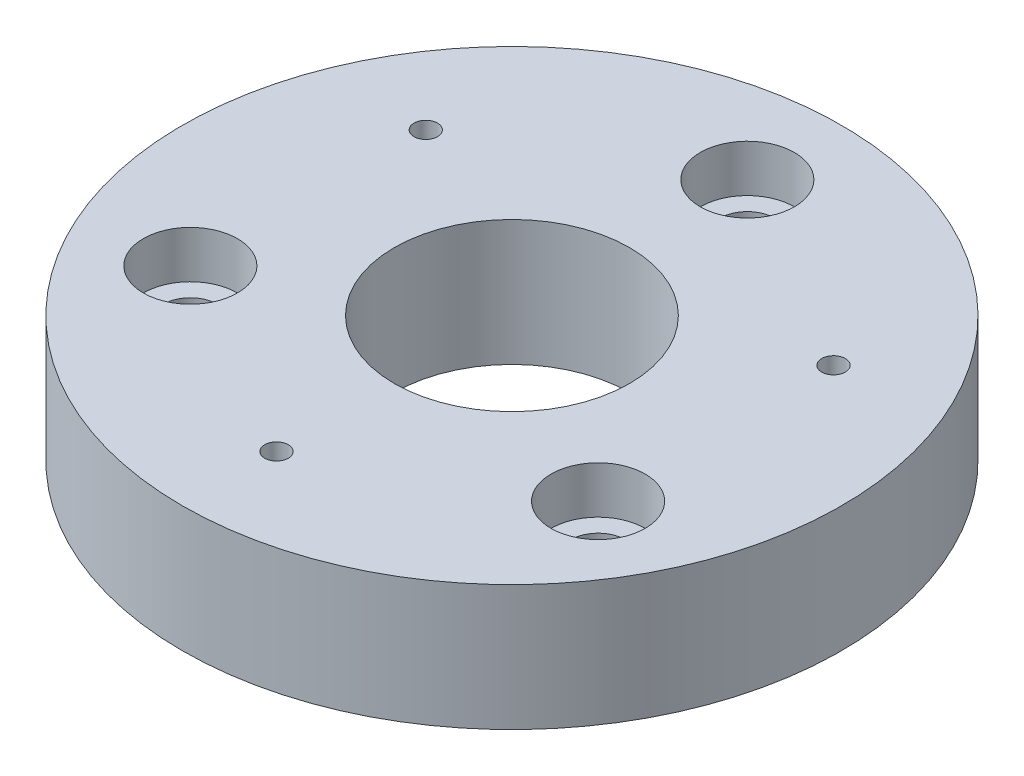
ISO-10303-21;
HEADER;
FILE_DESCRIPTION(('STEP AP214'),'2;1');
FILE_NAME('part.step','',(''),(''),'','','');
FILE_SCHEMA(('AUTOMOTIVE_DESIGN { 1 0 10303 214 1 1 1 1 }'));
ENDSEC;
DATA;
#1=APPLICATION_CONTEXT('core data for automotive mechanical design processes');
#2=APPLICATION_PROTOCOL_DEFINITION('international standard','automotive_design',2000,#1);
#3=PRODUCT_CONTEXT('',#1,'mechanical');
#4=PRODUCT('Part','Part','',(#3));
#5=PRODUCT_RELATED_PRODUCT_CATEGORY('part','',(#4));
#6=PRODUCT_DEFINITION_FORMATION('','',#4);
#7=PRODUCT_DEFINITION_CONTEXT('part definition',#1,'design');
#8=PRODUCT_DEFINITION('design','',#6,#7);
#9=PRODUCT_DEFINITION_SHAPE('','',#8);
#10=(LENGTH_UNIT() NAMED_UNIT(*) SI_UNIT(.MILLI.,.METRE.));
#11=(NAMED_UNIT(*) PLANE_ANGLE_UNIT() SI_UNIT($,.RADIAN.));
#12=(NAMED_UNIT(*) SI_UNIT($,.STERADIAN.) SOLID_ANGLE_UNIT());
#13=UNCERTAINTY_MEASURE_WITH_UNIT(LENGTH_MEASURE(1.E-05),#10,'distance_accuracy_value','');
#14=(GEOMETRIC_REPRESENTATION_CONTEXT(3) GLOBAL_UNCERTAINTY_ASSIGNED_CONTEXT((#13)) GLOBAL_UNIT_ASSIGNED_CONTEXT((#10,
#11,#12)) REPRESENTATION_CONTEXT('',''));
#15=CARTESIAN_POINT('',(0.,0.,0.));
#16=DIRECTION('',(0.,0.,1.));
#17=DIRECTION('',(1.,0.,0.));
#18=AXIS2_PLACEMENT_3D('',#15,#16,#17);
#19=CARTESIAN_POINT('',(0.,8.,-15.));
#20=DIRECTION('',(0.,-1.,0.));
#21=DIRECTION('',(0.,0.,-1.));
#22=AXIS2_PLACEMENT_3D('',#19,#20,#21);
#23=CYLINDRICAL_SURFACE('',#22,1.75);
#24=CARTESIAN_POINT('',(0.,0.,-15.));
#25=DIRECTION('',(0.,1.,0.));
#26=DIRECTION('',(0.,0.,1.));
#27=AXIS2_PLACEMENT_3D('',#24,#25,#26);
#28=CIRCLE('',#27,1.75);
#29=CARTESIAN_POINT('',(0.,0.,-13.25));
#30=VERTEX_POINT('',#29);
#31=EDGE_CURVE('E44',#30,#30,#28,.T.);
#32=ORIENTED_EDGE('',*,*,#31,.F.);
#33=EDGE_LOOP('',(#32));
#34=FACE_BOUND('',#33,.T.);
#35=CARTESIAN_POINT('',(0.,5.,-15.));
#36=DIRECTION('',(0.,1.,0.));
#37=DIRECTION('',(0.,0.,1.));
#38=AXIS2_PLACEMENT_3D('',#35,#36,#37);
#39=CIRCLE('',#38,1.75);
#40=CARTESIAN_POINT('',(0.,5.,-13.25));
#41=VERTEX_POINT('',#40);
#42=EDGE_CURVE('E35',#41,#41,#39,.T.);
#43=ORIENTED_EDGE('',*,*,#42,.T.);
#44=EDGE_LOOP('',(#43));
#45=FACE_BOUND('',#44,.T.);
#46=ADVANCED_FACE('F31',(#34,#45),#23,.F.);
#47=CARTESIAN_POINT('',(12.9903810567675,8.,7.49999999999945));
#48=DIRECTION('',(0.,-1.,0.));
#49=DIRECTION('',(0.,0.,-1.));
#50=AXIS2_PLACEMENT_3D('',#47,#48,#49);
#51=CYLINDRICAL_SURFACE('',#50,1.75000000000082);
#52=CARTESIAN_POINT('',(12.9903810567675,0.,7.49999999999945));
#53=DIRECTION('',(0.,1.,0.));
#54=DIRECTION('',(0.,0.,1.));
#55=AXIS2_PLACEMENT_3D('',#52,#53,#54);
#56=CIRCLE('',#55,1.75000000000082);
#57=CARTESIAN_POINT('',(12.9903810567675,0.,9.25000000000027));
#58=VERTEX_POINT('',#57);
#59=EDGE_CURVE('E82',#58,#58,#56,.T.);
#60=ORIENTED_EDGE('',*,*,#59,.F.);
#61=EDGE_LOOP('',(#60));
#62=FACE_BOUND('',#61,.T.);
#63=CARTESIAN_POINT('',(12.9903810567675,5.,7.49999999999945));
#64=DIRECTION('',(0.,1.,0.));
#65=DIRECTION('',(0.,0.,1.));
#66=AXIS2_PLACEMENT_3D('',#63,#64,#65);
#67=CIRCLE('',#66,1.75000000000082);
#68=CARTESIAN_POINT('',(12.9903810567675,5.,9.25000000000027));
#69=VERTEX_POINT('',#68);
#70=EDGE_CURVE('E51',#69,#69,#67,.T.);
#71=ORIENTED_EDGE('',*,*,#70,.T.);
#72=EDGE_LOOP('',(#71));
#73=FACE_BOUND('',#72,.T.);
#74=ADVANCED_FACE('F112',(#62,#73),#51,.F.);
#75=CARTESIAN_POINT('',(-12.9903810567656,8.,7.50000000000056));
#76=DIRECTION('',(0.,-1.,0.));
#77=DIRECTION('',(0.,0.,-1.));
#78=AXIS2_PLACEMENT_3D('',#75,#76,#77);
#79=CYLINDRICAL_SURFACE('',#78,1.75000000000122);
#80=CARTESIAN_POINT('',(-12.9903810567656,0.,7.50000000000056));
#81=DIRECTION('',(0.,1.,0.));
#82=DIRECTION('',(0.,0.,1.));
#83=AXIS2_PLACEMENT_3D('',#80,#81,#82);
#84=CIRCLE('',#83,1.75000000000122);
#85=CARTESIAN_POINT('',(-12.9903810567656,0.,9.25000000000177));
#86=VERTEX_POINT('',#85);
#87=EDGE_CURVE('E73',#86,#86,#84,.T.);
#88=ORIENTED_EDGE('',*,*,#87,.F.);
#89=EDGE_LOOP('',(#88));
#90=FACE_BOUND('',#89,.T.);
#91=CARTESIAN_POINT('',(-12.9903810567656,5.,7.50000000000056));
#92=DIRECTION('',(0.,1.,0.));
#93=DIRECTION('',(0.,0.,1.));
#94=AXIS2_PLACEMENT_3D('',#91,#92,#93);
#95=CIRCLE('',#94,1.75000000000122);
#96=CARTESIAN_POINT('',(-12.9903810567656,5.,9.25000000000177));
#97=VERTEX_POINT('',#96);
#98=EDGE_CURVE('E49',#97,#97,#95,.T.);
#99=ORIENTED_EDGE('',*,*,#98,.T.);
#100=EDGE_LOOP('',(#99));
#101=FACE_BOUND('',#100,.T.);
#102=ADVANCED_FACE('F117',(#90,#101),#79,.F.);
#103=CARTESIAN_POINT('',(0.,8.,0.));
#104=DIRECTION('',(0.,1.,0.));
#105=DIRECTION('',(0.,0.,1.));
#106=AXIS2_PLACEMENT_3D('',#103,#104,#105);
#107=PLANE('',#106);
#108=CARTESIAN_POINT('',(0.,8.,-15.));
#109=DIRECTION('',(0.,1.,0.));
#110=DIRECTION('',(0.,0.,1.));
#111=AXIS2_PLACEMENT_3D('',#108,#109,#110);
#112=CIRCLE('',#111,3.);
#113=CARTESIAN_POINT('',(0.,8.,-12.));
#114=VERTEX_POINT('',#113);
#115=EDGE_CURVE('E257',#114,#114,#112,.T.);
#116=ORIENTED_EDGE('',*,*,#115,.F.);
#117=EDGE_LOOP('',(#116));
#118=FACE_BOUND('',#117,.T.);
#119=CARTESIAN_POINT('',(12.9903810567675,8.,7.49999999999945));
#120=DIRECTION('',(0.,1.,0.));
#121=DIRECTION('',(0.,0.,1.));
#122=AXIS2_PLACEMENT_3D('',#119,#120,#121);
#123=CIRCLE('',#122,3.00000000000082);
#124=CARTESIAN_POINT('',(12.9903810567675,8.,10.5000000000003));
#125=VERTEX_POINT('',#124);
#126=EDGE_CURVE('E265',#125,#125,#123,.T.);
#127=ORIENTED_EDGE('',*,*,#126,.F.);
#128=EDGE_LOOP('',(#127));
#129=FACE_BOUND('',#128,.T.);
#130=CARTESIAN_POINT('',(-12.9903810567656,8.,7.50000000000056));
#131=DIRECTION('',(0.,1.,0.));
#132=DIRECTION('',(0.,0.,1.));
#133=AXIS2_PLACEMENT_3D('',#130,#131,#132);
#134=CIRCLE('',#133,3.00000000000122);
#135=CARTESIAN_POINT('',(-12.9903810567656,8.,10.5000000000018));
#136=VERTEX_POINT('',#135);
#137=EDGE_CURVE('E270',#136,#136,#134,.T.);
#138=ORIENTED_EDGE('',*,*,#137,.F.);
#139=EDGE_LOOP('',(#138));
#140=FACE_BOUND('',#139,.T.);
#141=CARTESIAN_POINT('',(-12.990381056767,8.,-7.49999999999933));
#142=DIRECTION('',(0.,1.,0.));
#143=DIRECTION('',(0.,0.,1.));
#144=AXIS2_PLACEMENT_3D('',#141,#142,#143);
#145=CIRCLE('',#144,0.75);
#146=CARTESIAN_POINT('',(-12.990381056767,8.,-6.74999999999933));
#147=VERTEX_POINT('',#146);
#148=EDGE_CURVE('E70',#147,#147,#145,.T.);
#149=ORIENTED_EDGE('',*,*,#148,.F.);
#150=EDGE_LOOP('',(#149));
#151=FACE_BOUND('',#150,.T.);
#152=CARTESIAN_POINT('',(8.47140372315957E-13,8.,15.));
#153=DIRECTION('',(0.,1.,0.));
#154=DIRECTION('',(0.,0.,1.));
#155=AXIS2_PLACEMENT_3D('',#152,#153,#154);
#156=CIRCLE('',#155,0.75);
#157=CARTESIAN_POINT('',(8.47140372315957E-13,8.,15.75));
#158=VERTEX_POINT('',#157);
#159=EDGE_CURVE('E79',#158,#158,#156,.T.);
#160=ORIENTED_EDGE('',*,*,#159,.F.);
#161=EDGE_LOOP('',(#160));
#162=FACE_BOUND('',#161,.T.);
#163=CARTESIAN_POINT('',(0.,8.,0.));
#164=DIRECTION('',(0.,1.,0.));
#165=DIRECTION('',(0.,0.,1.));
#166=AXIS2_PLACEMENT_3D('',#163,#164,#165);
#167=CIRCLE('',#166,7.5);
#168=CARTESIAN_POINT('',(0.,8.,7.5));
#169=VERTEX_POINT('',#168);
#170=EDGE_CURVE('E88',#169,#169,#167,.T.);
#171=ORIENTED_EDGE('',*,*,#170,.F.);
#172=EDGE_LOOP('',(#171));
#173=FACE_BOUND('',#172,.T.);
#174=CARTESIAN_POINT('',(0.,8.,0.));
#175=DIRECTION('',(0.,1.,0.));
#176=DIRECTION('',(0.,0.,1.));
#177=AXIS2_PLACEMENT_3D('',#174,#175,#176);
#178=CIRCLE('',#177,21.);
#179=CARTESIAN_POINT('',(0.,8.,21.));
#180=VERTEX_POINT('',#179);
#181=EDGE_CURVE('E10',#180,#180,#178,.T.);
#182=ORIENTED_EDGE('',*,*,#181,.T.);
#183=EDGE_LOOP('',(#182));
#184=FACE_BOUND('',#183,.T.);
#185=CARTESIAN_POINT('',(12.9903810567662,8.,-7.50000000000061));
#186=DIRECTION('',(0.,1.,0.));
#187=DIRECTION('',(0.,0.,1.));
#188=AXIS2_PLACEMENT_3D('',#185,#186,#187);
#189=CIRCLE('',#188,0.750000000000001);
#190=CARTESIAN_POINT('',(12.9903810567662,8.,-6.75000000000061));
#191=VERTEX_POINT('',#190);
#192=EDGE_CURVE('E61',#191,#191,#189,.T.);
#193=ORIENTED_EDGE('',*,*,#192,.F.);
#194=EDGE_LOOP('',(#193));
#195=FACE_BOUND('',#194,.T.);
#196=ADVANCED_FACE('F121',(#118,#129,#140,#151,#162,#173,#184,#195),#107,.T.);
#197=CARTESIAN_POINT('',(0.,0.,0.));
#198=DIRECTION('',(0.,1.,0.));
#199=DIRECTION('',(0.,0.,1.));
#200=AXIS2_PLACEMENT_3D('',#197,#198,#199);
#201=PLANE('',#200);
#202=CARTESIAN_POINT('',(0.,0.,0.));
#203=DIRECTION('',(0.,1.,0.));
#204=DIRECTION('',(0.,0.,1.));
#205=AXIS2_PLACEMENT_3D('',#202,#203,#204);
#206=CIRCLE('',#205,21.);
#207=CARTESIAN_POINT('',(0.,0.,21.));
#208=VERTEX_POINT('',#207);
#209=EDGE_CURVE('E39',#208,#208,#206,.T.);
#210=ORIENTED_EDGE('',*,*,#209,.F.);
#211=EDGE_LOOP('',(#210));
#212=FACE_BOUND('',#211,.T.);
#213=ORIENTED_EDGE('',*,*,#31,.T.);
#214=EDGE_LOOP('',(#213));
#215=FACE_BOUND('',#214,.T.);
#216=CARTESIAN_POINT('',(0.,0.,0.));
#217=DIRECTION('',(0.,1.,0.));
#218=DIRECTION('',(0.,0.,1.));
#219=AXIS2_PLACEMENT_3D('',#216,#217,#218);
#220=CIRCLE('',#219,7.5);
#221=CARTESIAN_POINT('',(0.,0.,7.5));
#222=VERTEX_POINT('',#221);
#223=EDGE_CURVE('E87',#222,#222,#220,.T.);
#224=ORIENTED_EDGE('',*,*,#223,.T.);
#225=EDGE_LOOP('',(#224));
#226=FACE_BOUND('',#225,.T.);
#227=ORIENTED_EDGE('',*,*,#59,.T.);
#228=EDGE_LOOP('',(#227));
#229=FACE_BOUND('',#228,.T.);
#230=CARTESIAN_POINT('',(8.47140372315957E-13,0.,15.));
#231=DIRECTION('',(0.,1.,0.));
#232=DIRECTION('',(0.,0.,1.));
#233=AXIS2_PLACEMENT_3D('',#230,#231,#232);
#234=CIRCLE('',#233,0.75);
#235=CARTESIAN_POINT('',(8.47140372315957E-13,0.,15.75));
#236=VERTEX_POINT('',#235);
#237=EDGE_CURVE('E78',#236,#236,#234,.T.);
#238=ORIENTED_EDGE('',*,*,#237,.T.);
#239=EDGE_LOOP('',(#238));
#240=FACE_BOUND('',#239,.T.);
#241=ORIENTED_EDGE('',*,*,#87,.T.);
#242=EDGE_LOOP('',(#241));
#243=FACE_BOUND('',#242,.T.);
#244=CARTESIAN_POINT('',(-12.990381056767,0.,-7.49999999999933));
#245=DIRECTION('',(0.,1.,0.));
#246=DIRECTION('',(0.,0.,1.));
#247=AXIS2_PLACEMENT_3D('',#244,#245,#246);
#248=CIRCLE('',#247,0.75);
#249=CARTESIAN_POINT('',(-12.990381056767,0.,-6.74999999999933));
#250=VERTEX_POINT('',#249);
#251=EDGE_CURVE('E66',#250,#250,#248,.T.);
#252=ORIENTED_EDGE('',*,*,#251,.T.);
#253=EDGE_LOOP('',(#252));
#254=FACE_BOUND('',#253,.T.);
#255=CARTESIAN_POINT('',(12.9903810567662,0.,-7.50000000000061));
#256=DIRECTION('',(0.,1.,0.));
#257=DIRECTION('',(0.,0.,1.));
#258=AXIS2_PLACEMENT_3D('',#255,#256,#257);
#259=CIRCLE('',#258,0.750000000000001);
#260=CARTESIAN_POINT('',(12.9903810567662,0.,-6.75000000000061));
#261=VERTEX_POINT('',#260);
#262=EDGE_CURVE('E57',#261,#261,#259,.T.);
#263=ORIENTED_EDGE('',*,*,#262,.T.);
#264=EDGE_LOOP('',(#263));
#265=FACE_BOUND('',#264,.T.);
#266=ADVANCED_FACE('F93',(#212,#215,#226,#229,#240,#243,#254,#265),#201,.F.);
#267=CARTESIAN_POINT('',(0.,8.,0.));
#268=DIRECTION('',(0.,-1.,0.));
#269=DIRECTION('',(0.,0.,-1.));
#270=AXIS2_PLACEMENT_3D('',#267,#268,#269);
#271=CYLINDRICAL_SURFACE('',#270,21.);
#272=ORIENTED_EDGE('',*,*,#181,.F.);
#273=EDGE_LOOP('',(#272));
#274=FACE_BOUND('',#273,.T.);
#275=ORIENTED_EDGE('',*,*,#209,.T.);
#276=EDGE_LOOP('',(#275));
#277=FACE_BOUND('',#276,.T.);
#278=ADVANCED_FACE('F33',(#274,#277),#271,.T.);
#279=CARTESIAN_POINT('',(0.,8.,0.));
#280=DIRECTION('',(0.,-1.,0.));
#281=DIRECTION('',(0.,0.,-1.));
#282=AXIS2_PLACEMENT_3D('',#279,#280,#281);
#283=CYLINDRICAL_SURFACE('',#282,7.5);
#284=ORIENTED_EDGE('',*,*,#170,.T.);
#285=EDGE_LOOP('',(#284));
#286=FACE_BOUND('',#285,.T.);
#287=ORIENTED_EDGE('',*,*,#223,.F.);
#288=EDGE_LOOP('',(#287));
#289=FACE_BOUND('',#288,.T.);
#290=ADVANCED_FACE('F96',(#286,#289),#283,.F.);
#291=CARTESIAN_POINT('',(8.47140372315957E-13,8.,15.));
#292=DIRECTION('',(0.,-1.,0.));
#293=DIRECTION('',(0.,0.,-1.));
#294=AXIS2_PLACEMENT_3D('',#291,#292,#293);
#295=CYLINDRICAL_SURFACE('',#294,0.75);
#296=ORIENTED_EDGE('',*,*,#159,.T.);
#297=EDGE_LOOP('',(#296));
#298=FACE_BOUND('',#297,.T.);
#299=ORIENTED_EDGE('',*,*,#237,.F.);
#300=EDGE_LOOP('',(#299));
#301=FACE_BOUND('',#300,.T.);
#302=ADVANCED_FACE('F98',(#298,#301),#295,.F.);
#303=CARTESIAN_POINT('',(-12.990381056767,8.,-7.49999999999933));
#304=DIRECTION('',(0.,-1.,0.));
#305=DIRECTION('',(0.,0.,-1.));
#306=AXIS2_PLACEMENT_3D('',#303,#304,#305);
#307=CYLINDRICAL_SURFACE('',#306,0.75);
#308=ORIENTED_EDGE('',*,*,#148,.T.);
#309=EDGE_LOOP('',(#308));
#310=FACE_BOUND('',#309,.T.);
#311=ORIENTED_EDGE('',*,*,#251,.F.);
#312=EDGE_LOOP('',(#311));
#313=FACE_BOUND('',#312,.T.);
#314=ADVANCED_FACE('F105',(#310,#313),#307,.F.);
#315=CARTESIAN_POINT('',(12.9903810567662,8.,-7.50000000000061));
#316=DIRECTION('',(0.,-1.,0.));
#317=DIRECTION('',(0.,0.,-1.));
#318=AXIS2_PLACEMENT_3D('',#315,#316,#317);
#319=CYLINDRICAL_SURFACE('',#318,0.750000000000001);
#320=ORIENTED_EDGE('',*,*,#192,.T.);
#321=EDGE_LOOP('',(#320));
#322=FACE_BOUND('',#321,.T.);
#323=ORIENTED_EDGE('',*,*,#262,.F.);
#324=EDGE_LOOP('',(#323));
#325=FACE_BOUND('',#324,.T.);
#326=ADVANCED_FACE('F158',(#322,#325),#319,.F.);
#327=CARTESIAN_POINT('',(-12.9903810567656,5.,7.50000000000056));
#328=DIRECTION('',(0.,1.,0.));
#329=DIRECTION('',(0.,0.,1.));
#330=AXIS2_PLACEMENT_3D('',#327,#328,#329);
#331=CYLINDRICAL_SURFACE('',#330,3.00000000000122);
#332=CARTESIAN_POINT('',(-12.9903810567656,5.,7.50000000000056));
#333=DIRECTION('',(0.,1.,0.));
#334=DIRECTION('',(0.,0.,1.));
#335=AXIS2_PLACEMENT_3D('',#332,#333,#334);
#336=CIRCLE('',#335,3.00000000000122);
#337=CARTESIAN_POINT('',(-12.9903810567656,5.,10.5000000000018));
#338=VERTEX_POINT('',#337);
#339=EDGE_CURVE('E268',#338,#338,#336,.T.);
#340=ORIENTED_EDGE('',*,*,#339,.F.);
#341=EDGE_LOOP('',(#340));
#342=FACE_BOUND('',#341,.T.);
#343=ORIENTED_EDGE('',*,*,#137,.T.);
#344=EDGE_LOOP('',(#343));
#345=FACE_BOUND('',#344,.T.);
#346=ADVANCED_FACE('F167',(#342,#345),#331,.F.);
#347=CARTESIAN_POINT('',(-12.9903810567656,5.,7.50000000000056));
#348=DIRECTION('',(0.,1.,0.));
#349=DIRECTION('',(0.,0.,1.));
#350=AXIS2_PLACEMENT_3D('',#347,#348,#349);
#351=PLANE('',#350);
#352=ORIENTED_EDGE('',*,*,#98,.F.);
#353=EDGE_LOOP('',(#352));
#354=FACE_BOUND('',#353,.T.);
#355=ORIENTED_EDGE('',*,*,#339,.T.);
#356=EDGE_LOOP('',(#355));
#357=FACE_BOUND('',#356,.T.);
#358=ADVANCED_FACE('F200',(#354,#357),#351,.T.);
#359=CARTESIAN_POINT('',(12.9903810567675,5.,7.49999999999945));
#360=DIRECTION('',(0.,1.,0.));
#361=DIRECTION('',(0.,0.,1.));
#362=AXIS2_PLACEMENT_3D('',#359,#360,#361);
#363=CYLINDRICAL_SURFACE('',#362,3.00000000000082);
#364=CARTESIAN_POINT('',(12.9903810567675,5.,7.49999999999945));
#365=DIRECTION('',(0.,1.,0.));
#366=DIRECTION('',(0.,0.,1.));
#367=AXIS2_PLACEMENT_3D('',#364,#365,#366);
#368=CIRCLE('',#367,3.00000000000082);
#369=CARTESIAN_POINT('',(12.9903810567675,5.,10.5000000000003));
#370=VERTEX_POINT('',#369);
#371=EDGE_CURVE('E260',#370,#370,#368,.T.);
#372=ORIENTED_EDGE('',*,*,#371,.F.);
#373=EDGE_LOOP('',(#372));
#374=FACE_BOUND('',#373,.T.);
#375=ORIENTED_EDGE('',*,*,#126,.T.);
#376=EDGE_LOOP('',(#375));
#377=FACE_BOUND('',#376,.T.);
#378=ADVANCED_FACE('F210',(#374,#377),#363,.F.);
#379=CARTESIAN_POINT('',(12.9903810567675,5.,7.49999999999945));
#380=DIRECTION('',(0.,1.,0.));
#381=DIRECTION('',(0.,0.,1.));
#382=AXIS2_PLACEMENT_3D('',#379,#380,#381);
#383=PLANE('',#382);
#384=ORIENTED_EDGE('',*,*,#70,.F.);
#385=EDGE_LOOP('',(#384));
#386=FACE_BOUND('',#385,.T.);
#387=ORIENTED_EDGE('',*,*,#371,.T.);
#388=EDGE_LOOP('',(#387));
#389=FACE_BOUND('',#388,.T.);
#390=ADVANCED_FACE('F220',(#386,#389),#383,.T.);
#391=CARTESIAN_POINT('',(0.,5.,-15.));
#392=DIRECTION('',(0.,1.,0.));
#393=DIRECTION('',(0.,0.,1.));
#394=AXIS2_PLACEMENT_3D('',#391,#392,#393);
#395=CYLINDRICAL_SURFACE('',#394,3.);
#396=CARTESIAN_POINT('',(0.,5.,-15.));
#397=DIRECTION('',(0.,1.,0.));
#398=DIRECTION('',(0.,0.,1.));
#399=AXIS2_PLACEMENT_3D('',#396,#397,#398);
#400=CIRCLE('',#399,3.);
#401=CARTESIAN_POINT('',(0.,5.,-12.));
#402=VERTEX_POINT('',#401);
#403=EDGE_CURVE('E52',#402,#402,#400,.T.);
#404=ORIENTED_EDGE('',*,*,#403,.F.);
#405=EDGE_LOOP('',(#404));
#406=FACE_BOUND('',#405,.T.);
#407=ORIENTED_EDGE('',*,*,#115,.T.);
#408=EDGE_LOOP('',(#407));
#409=FACE_BOUND('',#408,.T.);
#410=ADVANCED_FACE('F230',(#406,#409),#395,.F.);
#411=CARTESIAN_POINT('',(0.,5.,-15.));
#412=DIRECTION('',(0.,1.,0.));
#413=DIRECTION('',(0.,0.,1.));
#414=AXIS2_PLACEMENT_3D('',#411,#412,#413);
#415=PLANE('',#414);
#416=ORIENTED_EDGE('',*,*,#42,.F.);
#417=EDGE_LOOP('',(#416));
#418=FACE_BOUND('',#417,.T.);
#419=ORIENTED_EDGE('',*,*,#403,.T.);
#420=EDGE_LOOP('',(#419));
#421=FACE_BOUND('',#420,.T.);
#422=ADVANCED_FACE('F240',(#418,#421),#415,.T.);
#423=CLOSED_SHELL('',(#46,#74,#102,#196,#266,#278,#290,#302,#314,#326,#346,#358,#378,#390,#410,#422));
#424=MANIFOLD_SOLID_BREP('B2',#423);
#425=ADVANCED_BREP_SHAPE_REPRESENTATION('',(#18,#424),#14);
#426=SHAPE_DEFINITION_REPRESENTATION(#9,#425);
ENDSEC;
END-ISO-10303-21;
